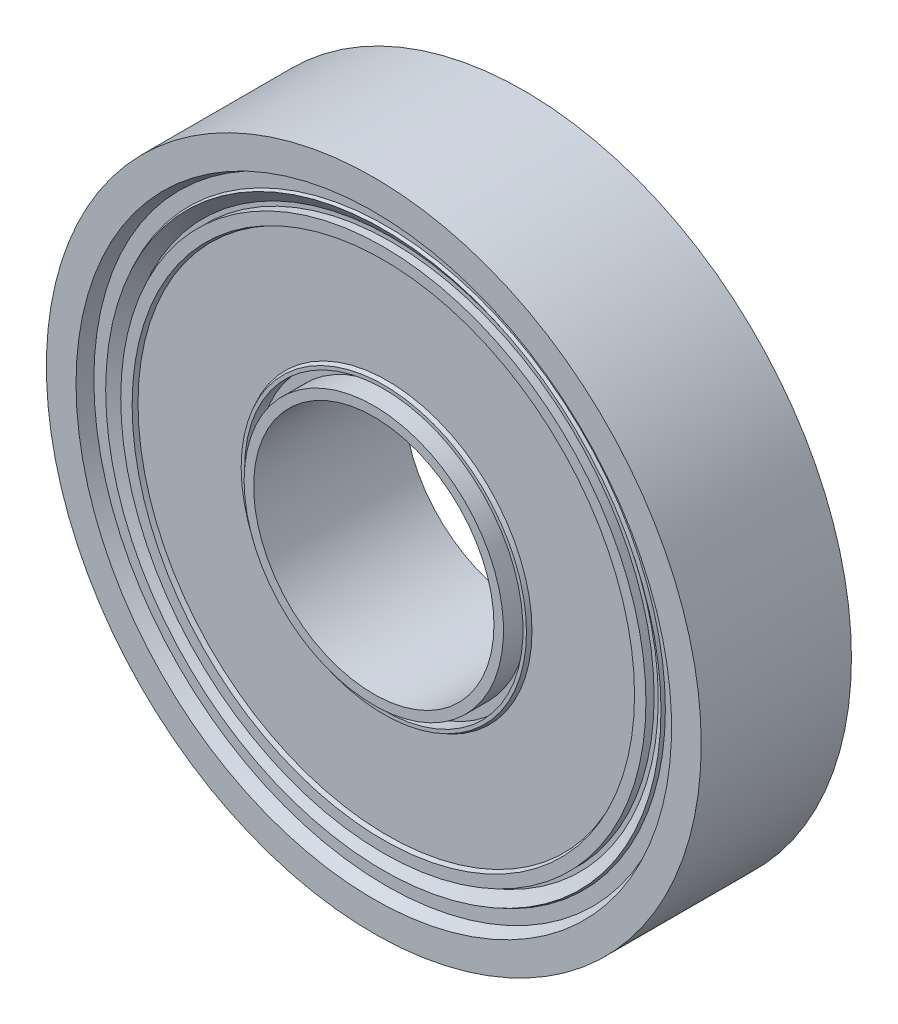
ISO-10303-21;
HEADER;
FILE_DESCRIPTION(('STEP AP214'),'2;1');
FILE_NAME('part.step','',(''),(''),'','','');
FILE_SCHEMA(('AUTOMOTIVE_DESIGN { 1 0 10303 214 1 1 1 1 }'));
ENDSEC;
DATA;
#1=APPLICATION_CONTEXT('core data for automotive mechanical design processes');
#2=APPLICATION_PROTOCOL_DEFINITION('international standard','automotive_design',2000,#1);
#3=PRODUCT_CONTEXT('',#1,'mechanical');
#4=PRODUCT('Part','Part','',(#3));
#5=PRODUCT_RELATED_PRODUCT_CATEGORY('part','',(#4));
#6=PRODUCT_DEFINITION_FORMATION('','',#4);
#7=PRODUCT_DEFINITION_CONTEXT('part definition',#1,'design');
#8=PRODUCT_DEFINITION('design','',#6,#7);
#9=PRODUCT_DEFINITION_SHAPE('','',#8);
#10=(LENGTH_UNIT() NAMED_UNIT(*) SI_UNIT(.MILLI.,.METRE.));
#11=(NAMED_UNIT(*) PLANE_ANGLE_UNIT() SI_UNIT($,.RADIAN.));
#12=(NAMED_UNIT(*) SI_UNIT($,.STERADIAN.) SOLID_ANGLE_UNIT());
#13=UNCERTAINTY_MEASURE_WITH_UNIT(LENGTH_MEASURE(1.E-05),#10,'distance_accuracy_value','');
#14=(GEOMETRIC_REPRESENTATION_CONTEXT(3) GLOBAL_UNCERTAINTY_ASSIGNED_CONTEXT((#13)) GLOBAL_UNIT_ASSIGNED_CONTEXT((#10,
#11,#12)) REPRESENTATION_CONTEXT('',''));
#15=CARTESIAN_POINT('',(0.,0.,0.));
#16=DIRECTION('',(0.,0.,1.));
#17=DIRECTION('',(1.,0.,0.));
#18=AXIS2_PLACEMENT_3D('',#15,#16,#17);
#19=CARTESIAN_POINT('',(0.,0.,0.));
#20=DIRECTION('',(0.,0.,1.));
#21=DIRECTION('',(1.,0.,0.));
#22=AXIS2_PLACEMENT_3D('',#19,#20,#21);
#23=PLANE('',#22);
#24=CARTESIAN_POINT('',(0.,0.,0.));
#25=DIRECTION('',(0.,0.,1.));
#26=DIRECTION('',(1.,0.,0.));
#27=AXIS2_PLACEMENT_3D('',#24,#25,#26);
#28=CIRCLE('',#27,10.9);
#29=CARTESIAN_POINT('',(10.9,0.,0.));
#30=VERTEX_POINT('',#29);
#31=EDGE_CURVE('E42',#30,#30,#28,.T.);
#32=ORIENTED_EDGE('',*,*,#31,.F.);
#33=EDGE_LOOP('',(#32));
#34=FACE_BOUND('',#33,.T.);
#35=CARTESIAN_POINT('',(0.,0.,0.));
#36=DIRECTION('',(0.,0.,-1.));
#37=DIRECTION('',(-1.,0.,0.));
#38=AXIS2_PLACEMENT_3D('',#35,#36,#37);
#39=CIRCLE('',#38,9.91293924454827);
#40=CARTESIAN_POINT('',(-9.91293924454827,0.,0.));
#41=VERTEX_POINT('',#40);
#42=EDGE_CURVE('E57',#41,#41,#39,.T.);
#43=ORIENTED_EDGE('',*,*,#42,.F.);
#44=EDGE_LOOP('',(#43));
#45=FACE_BOUND('',#44,.T.);
#46=ADVANCED_FACE('F38',(#34,#45),#23,.F.);
#47=CARTESIAN_POINT('',(0.,0.,5.));
#48=DIRECTION('',(0.,0.,1.));
#49=DIRECTION('',(1.,0.,0.));
#50=AXIS2_PLACEMENT_3D('',#47,#48,#49);
#51=PLANE('',#50);
#52=CARTESIAN_POINT('',(0.,0.,5.));
#53=DIRECTION('',(0.,0.,-1.));
#54=DIRECTION('',(-1.,0.,0.));
#55=AXIS2_PLACEMENT_3D('',#52,#53,#54);
#56=CIRCLE('',#55,9.91293924454827);
#57=CARTESIAN_POINT('',(-9.91293924454827,0.,5.));
#58=VERTEX_POINT('',#57);
#59=EDGE_CURVE('E60',#58,#58,#56,.T.);
#60=ORIENTED_EDGE('',*,*,#59,.T.);
#61=EDGE_LOOP('',(#60));
#62=FACE_BOUND('',#61,.T.);
#63=CARTESIAN_POINT('',(0.,0.,5.));
#64=DIRECTION('',(0.,0.,1.));
#65=DIRECTION('',(1.,0.,0.));
#66=AXIS2_PLACEMENT_3D('',#63,#64,#65);
#67=CIRCLE('',#66,10.9);
#68=CARTESIAN_POINT('',(10.9,0.,5.));
#69=VERTEX_POINT('',#68);
#70=EDGE_CURVE('E10',#69,#69,#67,.T.);
#71=ORIENTED_EDGE('',*,*,#70,.T.);
#72=EDGE_LOOP('',(#71));
#73=FACE_BOUND('',#72,.T.);
#74=ADVANCED_FACE('F147',(#62,#73),#51,.T.);
#75=CARTESIAN_POINT('',(0.,0.,5.));
#76=DIRECTION('',(0.,0.,-1.));
#77=DIRECTION('',(-1.,0.,0.));
#78=AXIS2_PLACEMENT_3D('',#75,#76,#77);
#79=CYLINDRICAL_SURFACE('',#78,10.9);
#80=ORIENTED_EDGE('',*,*,#70,.F.);
#81=EDGE_LOOP('',(#80));
#82=FACE_BOUND('',#81,.T.);
#83=ORIENTED_EDGE('',*,*,#31,.T.);
#84=EDGE_LOOP('',(#83));
#85=FACE_BOUND('',#84,.T.);
#86=ADVANCED_FACE('F40',(#82,#85),#79,.T.);
#87=CARTESIAN_POINT('',(0.,0.,0.));
#88=DIRECTION('',(0.,0.,-1.));
#89=DIRECTION('',(-1.,0.,0.));
#90=AXIS2_PLACEMENT_3D('',#87,#88,#89);
#91=CONICAL_SURFACE('',#90,9.91293924454827,0.410906341735328);
#92=CARTESIAN_POINT('',(0.,0.,0.413057315334044));
#93=DIRECTION('',(0.,0.,-1.));
#94=DIRECTION('',(-1.,0.,0.));
#95=AXIS2_PLACEMENT_3D('',#92,#93,#94);
#96=CIRCLE('',#95,9.73296637910687);
#97=CARTESIAN_POINT('',(-9.73296637910687,0.,0.413057315334044));
#98=VERTEX_POINT('',#97);
#99=EDGE_CURVE('E61',#98,#98,#96,.T.);
#100=ORIENTED_EDGE('',*,*,#99,.F.);
#101=EDGE_LOOP('',(#100));
#102=FACE_BOUND('',#101,.T.);
#103=ORIENTED_EDGE('',*,*,#42,.T.);
#104=EDGE_LOOP('',(#103));
#105=FACE_BOUND('',#104,.T.);
#106=ADVANCED_FACE('F325',(#102,#105),#91,.F.);
#107=CARTESIAN_POINT('',(-9.73296637910687,0.,0.413057315334044));
#108=DIRECTION('',(0.,0.,1.));
#109=DIRECTION('',(1.,0.,0.));
#110=AXIS2_PLACEMENT_3D('',#107,#108,#109);
#111=PLANE('',#110);
#112=CARTESIAN_POINT('',(0.,0.,0.413057315334044));
#113=DIRECTION('',(0.,0.,-1.));
#114=DIRECTION('',(-1.,0.,0.));
#115=AXIS2_PLACEMENT_3D('',#112,#113,#114);
#116=CIRCLE('',#115,9.29331335232563);
#117=CARTESIAN_POINT('',(-9.29331335232563,0.,0.413057315334044));
#118=VERTEX_POINT('',#117);
#119=EDGE_CURVE('E64',#118,#118,#116,.T.);
#120=ORIENTED_EDGE('',*,*,#119,.F.);
#121=EDGE_LOOP('',(#120));
#122=FACE_BOUND('',#121,.T.);
#123=ORIENTED_EDGE('',*,*,#99,.T.);
#124=EDGE_LOOP('',(#123));
#125=FACE_BOUND('',#124,.T.);
#126=ADVANCED_FACE('F319',(#122,#125),#111,.F.);
#127=CARTESIAN_POINT('',(0.,0.,0.413057315334044));
#128=DIRECTION('',(0.,0.,1.));
#129=DIRECTION('',(1.,0.,0.));
#130=AXIS2_PLACEMENT_3D('',#127,#128,#129);
#131=CONICAL_SURFACE('',#130,9.29331335232563,0.4817608629615);
#132=CARTESIAN_POINT('',(0.,0.,0.31713796498969));
#133=DIRECTION('',(0.,0.,-1.));
#134=DIRECTION('',(-1.,0.,0.));
#135=AXIS2_PLACEMENT_3D('',#132,#133,#134);
#136=CIRCLE('',#135,9.24316182218617);
#137=CARTESIAN_POINT('',(-9.24316182218617,0.,0.31713796498969));
#138=VERTEX_POINT('',#137);
#139=EDGE_CURVE('E67',#138,#138,#136,.T.);
#140=ORIENTED_EDGE('',*,*,#139,.F.);
#141=EDGE_LOOP('',(#140));
#142=FACE_BOUND('',#141,.T.);
#143=ORIENTED_EDGE('',*,*,#119,.T.);
#144=EDGE_LOOP('',(#143));
#145=FACE_BOUND('',#144,.T.);
#146=ADVANCED_FACE('F313',(#142,#145),#131,.T.);
#147=CARTESIAN_POINT('',(0.,0.,0.31713796498969));
#148=DIRECTION('',(0.,0.,-1.));
#149=DIRECTION('',(-1.,0.,0.));
#150=AXIS2_PLACEMENT_3D('',#147,#148,#149);
#151=CONICAL_SURFACE('',#150,9.24316182218617,0.927295218001614);
#152=CARTESIAN_POINT('',(0.,0.,0.590447756283406));
#153=DIRECTION('',(0.,0.,-1.));
#154=DIRECTION('',(-1.,0.,0.));
#155=AXIS2_PLACEMENT_3D('',#152,#153,#154);
#156=CIRCLE('',#155,8.87874876712788);
#157=CARTESIAN_POINT('',(-8.87874876712788,0.,0.590447756283406));
#158=VERTEX_POINT('',#157);
#159=EDGE_CURVE('E70',#158,#158,#156,.T.);
#160=ORIENTED_EDGE('',*,*,#159,.F.);
#161=EDGE_LOOP('',(#160));
#162=FACE_BOUND('',#161,.T.);
#163=ORIENTED_EDGE('',*,*,#139,.T.);
#164=EDGE_LOOP('',(#163));
#165=FACE_BOUND('',#164,.T.);
#166=ADVANCED_FACE('F307',(#162,#165),#151,.F.);
#167=CARTESIAN_POINT('',(-8.87874876712788,0.,0.590447756283406));
#168=DIRECTION('',(0.,0.,1.));
#169=DIRECTION('',(1.,0.,0.));
#170=AXIS2_PLACEMENT_3D('',#167,#168,#169);
#171=PLANE('',#170);
#172=CARTESIAN_POINT('',(0.,0.,0.590447756283406));
#173=DIRECTION('',(0.,0.,-1.));
#174=DIRECTION('',(-1.,0.,0.));
#175=AXIS2_PLACEMENT_3D('',#172,#173,#174);
#176=CIRCLE('',#175,8.74209387148102);
#177=CARTESIAN_POINT('',(-8.74209387148102,0.,0.590447756283406));
#178=VERTEX_POINT('',#177);
#179=EDGE_CURVE('E73',#178,#178,#176,.T.);
#180=ORIENTED_EDGE('',*,*,#179,.F.);
#181=EDGE_LOOP('',(#180));
#182=FACE_BOUND('',#181,.T.);
#183=ORIENTED_EDGE('',*,*,#159,.T.);
#184=EDGE_LOOP('',(#183));
#185=FACE_BOUND('',#184,.T.);
#186=ADVANCED_FACE('F301',(#182,#185),#171,.F.);
#187=CARTESIAN_POINT('',(0.,0.,0.));
#188=DIRECTION('',(0.,0.,-1.));
#189=DIRECTION('',(-1.,0.,0.));
#190=AXIS2_PLACEMENT_3D('',#187,#188,#189);
#191=CYLINDRICAL_SURFACE('',#190,8.74209387148102);
#192=CARTESIAN_POINT('',(0.,0.,0.31713796498969));
#193=DIRECTION('',(0.,0.,-1.));
#194=DIRECTION('',(-1.,0.,0.));
#195=AXIS2_PLACEMENT_3D('',#192,#193,#194);
#196=CIRCLE('',#195,8.74209387148102);
#197=CARTESIAN_POINT('',(-8.74209387148102,0.,0.31713796498969));
#198=VERTEX_POINT('',#197);
#199=EDGE_CURVE('E76',#198,#198,#196,.T.);
#200=ORIENTED_EDGE('',*,*,#199,.F.);
#201=EDGE_LOOP('',(#200));
#202=FACE_BOUND('',#201,.T.);
#203=ORIENTED_EDGE('',*,*,#179,.T.);
#204=EDGE_LOOP('',(#203));
#205=FACE_BOUND('',#204,.T.);
#206=ADVANCED_FACE('F295',(#202,#205),#191,.T.);
#207=CARTESIAN_POINT('',(-8.74209387148102,0.,0.31713796498969));
#208=DIRECTION('',(0.,0.,1.));
#209=DIRECTION('',(1.,0.,0.));
#210=AXIS2_PLACEMENT_3D('',#207,#208,#209);
#211=PLANE('',#210);
#212=CARTESIAN_POINT('',(0.,0.,0.31713796498969));
#213=DIRECTION('',(0.,0.,-1.));
#214=DIRECTION('',(-1.,0.,0.));
#215=AXIS2_PLACEMENT_3D('',#212,#213,#214);
#216=CIRCLE('',#215,8.36249693912864);
#217=CARTESIAN_POINT('',(-8.36249693912864,0.,0.31713796498969));
#218=VERTEX_POINT('',#217);
#219=EDGE_CURVE('E79',#218,#218,#216,.T.);
#220=ORIENTED_EDGE('',*,*,#219,.F.);
#221=EDGE_LOOP('',(#220));
#222=FACE_BOUND('',#221,.T.);
#223=ORIENTED_EDGE('',*,*,#199,.T.);
#224=EDGE_LOOP('',(#223));
#225=FACE_BOUND('',#224,.T.);
#226=ADVANCED_FACE('F289',(#222,#225),#211,.F.);
#227=CARTESIAN_POINT('',(0.,0.,0.31713796498969));
#228=DIRECTION('',(0.,0.,-1.));
#229=DIRECTION('',(-1.,0.,0.));
#230=AXIS2_PLACEMENT_3D('',#227,#228,#229);
#231=CONICAL_SURFACE('',#230,8.36249693912864,0.410906341735327);
#232=CARTESIAN_POINT('',(0.,0.,0.453792860636549));
#233=DIRECTION('',(0.,0.,-1.));
#234=DIRECTION('',(-1.,0.,0.));
#235=AXIS2_PLACEMENT_3D('',#232,#233,#234);
#236=CIRCLE('',#235,8.3029551461785);
#237=CARTESIAN_POINT('',(-8.3029551461785,0.,0.453792860636549));
#238=VERTEX_POINT('',#237);
#239=EDGE_CURVE('E82',#238,#238,#236,.T.);
#240=ORIENTED_EDGE('',*,*,#239,.F.);
#241=EDGE_LOOP('',(#240));
#242=FACE_BOUND('',#241,.T.);
#243=ORIENTED_EDGE('',*,*,#219,.T.);
#244=EDGE_LOOP('',(#243));
#245=FACE_BOUND('',#244,.T.);
#246=ADVANCED_FACE('F283',(#242,#245),#231,.F.);
#247=CARTESIAN_POINT('',(-8.3029551461785,0.,0.453792860636549));
#248=DIRECTION('',(0.,0.,1.));
#249=DIRECTION('',(1.,0.,0.));
#250=AXIS2_PLACEMENT_3D('',#247,#248,#249);
#251=PLANE('',#250);
#252=CARTESIAN_POINT('',(0.,0.,0.453792860636549));
#253=DIRECTION('',(0.,0.,-1.));
#254=DIRECTION('',(-1.,0.,0.));
#255=AXIS2_PLACEMENT_3D('',#252,#253,#254);
#256=CIRCLE('',#255,4.81224538894744);
#257=CARTESIAN_POINT('',(-4.81224538894744,0.,0.453792860636549));
#258=VERTEX_POINT('',#257);
#259=EDGE_CURVE('E85',#258,#258,#256,.T.);
#260=ORIENTED_EDGE('',*,*,#259,.F.);
#261=EDGE_LOOP('',(#260));
#262=FACE_BOUND('',#261,.T.);
#263=ORIENTED_EDGE('',*,*,#239,.T.);
#264=EDGE_LOOP('',(#263));
#265=FACE_BOUND('',#264,.T.);
#266=ADVANCED_FACE('F277',(#262,#265),#251,.F.);
#267=CARTESIAN_POINT('',(0.,0.,0.453792860636549));
#268=DIRECTION('',(0.,0.,1.));
#269=DIRECTION('',(1.,0.,0.));
#270=AXIS2_PLACEMENT_3D('',#267,#268,#269);
#271=CONICAL_SURFACE('',#270,4.81224538894744,0.481760862961502);
#272=CARTESIAN_POINT('',(0.,0.,0.332321842283785));
#273=DIRECTION('',(0.,0.,-1.));
#274=DIRECTION('',(-1.,0.,0.));
#275=AXIS2_PLACEMENT_3D('',#272,#273,#274);
#276=CIRCLE('',#275,4.74873414313396);
#277=CARTESIAN_POINT('',(-4.74873414313396,0.,0.332321842283785));
#278=VERTEX_POINT('',#277);
#279=EDGE_CURVE('E88',#278,#278,#276,.T.);
#280=ORIENTED_EDGE('',*,*,#279,.F.);
#281=EDGE_LOOP('',(#280));
#282=FACE_BOUND('',#281,.T.);
#283=ORIENTED_EDGE('',*,*,#259,.T.);
#284=EDGE_LOOP('',(#283));
#285=FACE_BOUND('',#284,.T.);
#286=ADVANCED_FACE('F271',(#282,#285),#271,.T.);
#287=CARTESIAN_POINT('',(-4.74873414313396,0.,0.332321842283785));
#288=DIRECTION('',(0.,0.,1.));
#289=DIRECTION('',(1.,0.,0.));
#290=AXIS2_PLACEMENT_3D('',#287,#288,#289);
#291=PLANE('',#290);
#292=CARTESIAN_POINT('',(0.,0.,0.332321842283785));
#293=DIRECTION('',(0.,0.,-1.));
#294=DIRECTION('',(-1.,0.,0.));
#295=AXIS2_PLACEMENT_3D('',#292,#293,#294);
#296=CIRCLE('',#295,4.63566936916117);
#297=CARTESIAN_POINT('',(-4.63566936916117,0.,0.332321842283785));
#298=VERTEX_POINT('',#297);
#299=EDGE_CURVE('E91',#298,#298,#296,.T.);
#300=ORIENTED_EDGE('',*,*,#299,.F.);
#301=EDGE_LOOP('',(#300));
#302=FACE_BOUND('',#301,.T.);
#303=ORIENTED_EDGE('',*,*,#279,.T.);
#304=EDGE_LOOP('',(#303));
#305=FACE_BOUND('',#304,.T.);
#306=ADVANCED_FACE('F265',(#302,#305),#291,.F.);
#307=CARTESIAN_POINT('',(0.,0.,0.));
#308=DIRECTION('',(0.,0.,-1.));
#309=DIRECTION('',(-1.,0.,0.));
#310=AXIS2_PLACEMENT_3D('',#307,#308,#309);
#311=CYLINDRICAL_SURFACE('',#310,4.63566936916117);
#312=CARTESIAN_POINT('',(0.,0.,0.783278670014547));
#313=DIRECTION('',(0.,0.,-1.));
#314=DIRECTION('',(-1.,0.,0.));
#315=AXIS2_PLACEMENT_3D('',#312,#313,#314);
#316=CIRCLE('',#315,4.63566936916117);
#317=CARTESIAN_POINT('',(-4.63566936916117,0.,0.783278670014547));
#318=VERTEX_POINT('',#317);
#319=EDGE_CURVE('E94',#318,#318,#316,.T.);
#320=ORIENTED_EDGE('',*,*,#319,.F.);
#321=EDGE_LOOP('',(#320));
#322=FACE_BOUND('',#321,.T.);
#323=ORIENTED_EDGE('',*,*,#299,.T.);
#324=EDGE_LOOP('',(#323));
#325=FACE_BOUND('',#324,.T.);
#326=ADVANCED_FACE('F259',(#322,#325),#311,.F.);
#327=CARTESIAN_POINT('',(-4.63566936916117,0.,0.783278670014547));
#328=DIRECTION('',(0.,0.,1.));
#329=DIRECTION('',(1.,0.,0.));
#330=AXIS2_PLACEMENT_3D('',#327,#328,#329);
#331=PLANE('',#330);
#332=CARTESIAN_POINT('',(0.,0.,0.783278670014547));
#333=DIRECTION('',(0.,0.,-1.));
#334=DIRECTION('',(-1.,0.,0.));
#335=AXIS2_PLACEMENT_3D('',#332,#333,#334);
#336=CIRCLE('',#335,4.31783468458058);
#337=CARTESIAN_POINT('',(-4.31783468458058,0.,0.783278670014547));
#338=VERTEX_POINT('',#337);
#339=EDGE_CURVE('E97',#338,#338,#336,.T.);
#340=ORIENTED_EDGE('',*,*,#339,.F.);
#341=EDGE_LOOP('',(#340));
#342=FACE_BOUND('',#341,.T.);
#343=ORIENTED_EDGE('',*,*,#319,.T.);
#344=EDGE_LOOP('',(#343));
#345=FACE_BOUND('',#344,.T.);
#346=ADVANCED_FACE('F253',(#342,#345),#331,.F.);
#347=CARTESIAN_POINT('',(0.,0.,0.));
#348=DIRECTION('',(0.,0.,-1.));
#349=DIRECTION('',(-1.,0.,0.));
#350=AXIS2_PLACEMENT_3D('',#347,#348,#349);
#351=CYLINDRICAL_SURFACE('',#350,4.31783468458058);
#352=CARTESIAN_POINT('',(0.,0.,0.));
#353=DIRECTION('',(0.,0.,-1.));
#354=DIRECTION('',(-1.,0.,0.));
#355=AXIS2_PLACEMENT_3D('',#352,#353,#354);
#356=CIRCLE('',#355,4.31783468458058);
#357=CARTESIAN_POINT('',(-4.31783468458058,0.,0.));
#358=VERTEX_POINT('',#357);
#359=EDGE_CURVE('E100',#358,#358,#356,.T.);
#360=ORIENTED_EDGE('',*,*,#359,.F.);
#361=EDGE_LOOP('',(#360));
#362=FACE_BOUND('',#361,.T.);
#363=ORIENTED_EDGE('',*,*,#339,.T.);
#364=EDGE_LOOP('',(#363));
#365=FACE_BOUND('',#364,.T.);
#366=ADVANCED_FACE('F231',(#362,#365),#351,.T.);
#367=CARTESIAN_POINT('',(0.,0.,0.));
#368=DIRECTION('',(0.,0.,-1.));
#369=DIRECTION('',(-1.,0.,0.));
#370=AXIS2_PLACEMENT_3D('',#367,#368,#369);
#371=CYLINDRICAL_SURFACE('',#370,4.31783468458058);
#372=CARTESIAN_POINT('',(0.,0.,4.21672132998545));
#373=DIRECTION('',(0.,0.,-1.));
#374=DIRECTION('',(-1.,0.,0.));
#375=AXIS2_PLACEMENT_3D('',#372,#373,#374);
#376=CIRCLE('',#375,4.31783468458058);
#377=CARTESIAN_POINT('',(-4.31783468458058,0.,4.21672132998545));
#378=VERTEX_POINT('',#377);
#379=EDGE_CURVE('E105',#378,#378,#376,.T.);
#380=ORIENTED_EDGE('',*,*,#379,.F.);
#381=EDGE_LOOP('',(#380));
#382=FACE_BOUND('',#381,.T.);
#383=CARTESIAN_POINT('',(0.,0.,5.));
#384=DIRECTION('',(0.,0.,-1.));
#385=DIRECTION('',(-1.,0.,0.));
#386=AXIS2_PLACEMENT_3D('',#383,#384,#385);
#387=CIRCLE('',#386,4.31783468458058);
#388=CARTESIAN_POINT('',(-4.31783468458058,0.,5.));
#389=VERTEX_POINT('',#388);
#390=EDGE_CURVE('E54',#389,#389,#387,.T.);
#391=ORIENTED_EDGE('',*,*,#390,.T.);
#392=EDGE_LOOP('',(#391));
#393=FACE_BOUND('',#392,.T.);
#394=ADVANCED_FACE('F225',(#382,#393),#371,.T.);
#395=CARTESIAN_POINT('',(-4.63566936916117,0.,4.21672132998545));
#396=DIRECTION('',(0.,0.,-1.));
#397=DIRECTION('',(-1.,0.,0.));
#398=AXIS2_PLACEMENT_3D('',#395,#396,#397);
#399=PLANE('',#398);
#400=CARTESIAN_POINT('',(0.,0.,4.21672132998545));
#401=DIRECTION('',(0.,0.,-1.));
#402=DIRECTION('',(-1.,0.,0.));
#403=AXIS2_PLACEMENT_3D('',#400,#401,#402);
#404=CIRCLE('',#403,4.63566936916117);
#405=CARTESIAN_POINT('',(-4.63566936916117,0.,4.21672132998545));
#406=VERTEX_POINT('',#405);
#407=EDGE_CURVE('E108',#406,#406,#404,.T.);
#408=ORIENTED_EDGE('',*,*,#407,.F.);
#409=EDGE_LOOP('',(#408));
#410=FACE_BOUND('',#409,.T.);
#411=ORIENTED_EDGE('',*,*,#379,.T.);
#412=EDGE_LOOP('',(#411));
#413=FACE_BOUND('',#412,.T.);
#414=ADVANCED_FACE('F219',(#410,#413),#399,.F.);
#415=CARTESIAN_POINT('',(0.,0.,0.));
#416=DIRECTION('',(0.,0.,-1.));
#417=DIRECTION('',(-1.,0.,0.));
#418=AXIS2_PLACEMENT_3D('',#415,#416,#417);
#419=CYLINDRICAL_SURFACE('',#418,4.63566936916117);
#420=CARTESIAN_POINT('',(0.,0.,4.66767815771621));
#421=DIRECTION('',(0.,0.,-1.));
#422=DIRECTION('',(-1.,0.,0.));
#423=AXIS2_PLACEMENT_3D('',#420,#421,#422);
#424=CIRCLE('',#423,4.63566936916117);
#425=CARTESIAN_POINT('',(-4.63566936916117,0.,4.66767815771621));
#426=VERTEX_POINT('',#425);
#427=EDGE_CURVE('E111',#426,#426,#424,.T.);
#428=ORIENTED_EDGE('',*,*,#427,.F.);
#429=EDGE_LOOP('',(#428));
#430=FACE_BOUND('',#429,.T.);
#431=ORIENTED_EDGE('',*,*,#407,.T.);
#432=EDGE_LOOP('',(#431));
#433=FACE_BOUND('',#432,.T.);
#434=ADVANCED_FACE('F213',(#430,#433),#419,.F.);
#435=CARTESIAN_POINT('',(-4.74873414313396,0.,4.66767815771621));
#436=DIRECTION('',(0.,0.,-1.));
#437=DIRECTION('',(-1.,0.,0.));
#438=AXIS2_PLACEMENT_3D('',#435,#436,#437);
#439=PLANE('',#438);
#440=CARTESIAN_POINT('',(0.,0.,4.66767815771621));
#441=DIRECTION('',(0.,0.,-1.));
#442=DIRECTION('',(-1.,0.,0.));
#443=AXIS2_PLACEMENT_3D('',#440,#441,#442);
#444=CIRCLE('',#443,4.74873414313396);
#445=CARTESIAN_POINT('',(-4.74873414313396,0.,4.66767815771621));
#446=VERTEX_POINT('',#445);
#447=EDGE_CURVE('E114',#446,#446,#444,.T.);
#448=ORIENTED_EDGE('',*,*,#447,.F.);
#449=EDGE_LOOP('',(#448));
#450=FACE_BOUND('',#449,.T.);
#451=ORIENTED_EDGE('',*,*,#427,.T.);
#452=EDGE_LOOP('',(#451));
#453=FACE_BOUND('',#452,.T.);
#454=ADVANCED_FACE('F207',(#450,#453),#439,.F.);
#455=CARTESIAN_POINT('',(0.,0.,4.66767815771621));
#456=DIRECTION('',(0.,0.,-1.));
#457=DIRECTION('',(-1.,0.,0.));
#458=AXIS2_PLACEMENT_3D('',#455,#456,#457);
#459=CONICAL_SURFACE('',#458,4.74873414313396,0.481760862961502);
#460=CARTESIAN_POINT('',(0.,0.,4.54620713936345));
#461=DIRECTION('',(0.,0.,-1.));
#462=DIRECTION('',(-1.,0.,0.));
#463=AXIS2_PLACEMENT_3D('',#460,#461,#462);
#464=CIRCLE('',#463,4.81224538894744);
#465=CARTESIAN_POINT('',(-4.81224538894744,0.,4.54620713936345));
#466=VERTEX_POINT('',#465);
#467=EDGE_CURVE('E117',#466,#466,#464,.T.);
#468=ORIENTED_EDGE('',*,*,#467,.F.);
#469=EDGE_LOOP('',(#468));
#470=FACE_BOUND('',#469,.T.);
#471=ORIENTED_EDGE('',*,*,#447,.T.);
#472=EDGE_LOOP('',(#471));
#473=FACE_BOUND('',#472,.T.);
#474=ADVANCED_FACE('F201',(#470,#473),#459,.T.);
#475=CARTESIAN_POINT('',(-8.3029551461785,0.,4.54620713936345));
#476=DIRECTION('',(0.,0.,-1.));
#477=DIRECTION('',(-1.,0.,0.));
#478=AXIS2_PLACEMENT_3D('',#475,#476,#477);
#479=PLANE('',#478);
#480=CARTESIAN_POINT('',(0.,0.,4.54620713936345));
#481=DIRECTION('',(0.,0.,-1.));
#482=DIRECTION('',(-1.,0.,0.));
#483=AXIS2_PLACEMENT_3D('',#480,#481,#482);
#484=CIRCLE('',#483,8.3029551461785);
#485=CARTESIAN_POINT('',(-8.3029551461785,0.,4.54620713936345));
#486=VERTEX_POINT('',#485);
#487=EDGE_CURVE('E120',#486,#486,#484,.T.);
#488=ORIENTED_EDGE('',*,*,#487,.F.);
#489=EDGE_LOOP('',(#488));
#490=FACE_BOUND('',#489,.T.);
#491=ORIENTED_EDGE('',*,*,#467,.T.);
#492=EDGE_LOOP('',(#491));
#493=FACE_BOUND('',#492,.T.);
#494=ADVANCED_FACE('F195',(#490,#493),#479,.F.);
#495=CARTESIAN_POINT('',(0.,0.,4.54620713936345));
#496=DIRECTION('',(0.,0.,1.));
#497=DIRECTION('',(1.,0.,0.));
#498=AXIS2_PLACEMENT_3D('',#495,#496,#497);
#499=CONICAL_SURFACE('',#498,8.3029551461785,0.410906341735327);
#500=CARTESIAN_POINT('',(0.,0.,4.68286203501031));
#501=DIRECTION('',(0.,0.,-1.));
#502=DIRECTION('',(-1.,0.,0.));
#503=AXIS2_PLACEMENT_3D('',#500,#501,#502);
#504=CIRCLE('',#503,8.36249693912864);
#505=CARTESIAN_POINT('',(-8.36249693912864,0.,4.68286203501031));
#506=VERTEX_POINT('',#505);
#507=EDGE_CURVE('E123',#506,#506,#504,.T.);
#508=ORIENTED_EDGE('',*,*,#507,.F.);
#509=EDGE_LOOP('',(#508));
#510=FACE_BOUND('',#509,.T.);
#511=ORIENTED_EDGE('',*,*,#487,.T.);
#512=EDGE_LOOP('',(#511));
#513=FACE_BOUND('',#512,.T.);
#514=ADVANCED_FACE('F189',(#510,#513),#499,.F.);
#515=CARTESIAN_POINT('',(-8.74209387148102,0.,4.68286203501031));
#516=DIRECTION('',(0.,0.,-1.));
#517=DIRECTION('',(-1.,0.,0.));
#518=AXIS2_PLACEMENT_3D('',#515,#516,#517);
#519=PLANE('',#518);
#520=CARTESIAN_POINT('',(0.,0.,4.68286203501031));
#521=DIRECTION('',(0.,0.,-1.));
#522=DIRECTION('',(-1.,0.,0.));
#523=AXIS2_PLACEMENT_3D('',#520,#521,#522);
#524=CIRCLE('',#523,8.74209387148102);
#525=CARTESIAN_POINT('',(-8.74209387148102,0.,4.68286203501031));
#526=VERTEX_POINT('',#525);
#527=EDGE_CURVE('E126',#526,#526,#524,.T.);
#528=ORIENTED_EDGE('',*,*,#527,.F.);
#529=EDGE_LOOP('',(#528));
#530=FACE_BOUND('',#529,.T.);
#531=ORIENTED_EDGE('',*,*,#507,.T.);
#532=EDGE_LOOP('',(#531));
#533=FACE_BOUND('',#532,.T.);
#534=ADVANCED_FACE('F183',(#530,#533),#519,.F.);
#535=CARTESIAN_POINT('',(0.,0.,0.));
#536=DIRECTION('',(0.,0.,-1.));
#537=DIRECTION('',(-1.,0.,0.));
#538=AXIS2_PLACEMENT_3D('',#535,#536,#537);
#539=CYLINDRICAL_SURFACE('',#538,8.74209387148102);
#540=CARTESIAN_POINT('',(0.,0.,4.40955224371659));
#541=DIRECTION('',(0.,0.,-1.));
#542=DIRECTION('',(-1.,0.,0.));
#543=AXIS2_PLACEMENT_3D('',#540,#541,#542);
#544=CIRCLE('',#543,8.74209387148102);
#545=CARTESIAN_POINT('',(-8.74209387148102,0.,4.40955224371659));
#546=VERTEX_POINT('',#545);
#547=EDGE_CURVE('E129',#546,#546,#544,.T.);
#548=ORIENTED_EDGE('',*,*,#547,.F.);
#549=EDGE_LOOP('',(#548));
#550=FACE_BOUND('',#549,.T.);
#551=ORIENTED_EDGE('',*,*,#527,.T.);
#552=EDGE_LOOP('',(#551));
#553=FACE_BOUND('',#552,.T.);
#554=ADVANCED_FACE('F177',(#550,#553),#539,.T.);
#555=CARTESIAN_POINT('',(-8.87874876712788,0.,4.40955224371659));
#556=DIRECTION('',(0.,0.,-1.));
#557=DIRECTION('',(-1.,0.,0.));
#558=AXIS2_PLACEMENT_3D('',#555,#556,#557);
#559=PLANE('',#558);
#560=CARTESIAN_POINT('',(0.,0.,4.40955224371659));
#561=DIRECTION('',(0.,0.,-1.));
#562=DIRECTION('',(-1.,0.,0.));
#563=AXIS2_PLACEMENT_3D('',#560,#561,#562);
#564=CIRCLE('',#563,8.87874876712788);
#565=CARTESIAN_POINT('',(-8.87874876712788,0.,4.40955224371659));
#566=VERTEX_POINT('',#565);
#567=EDGE_CURVE('E132',#566,#566,#564,.T.);
#568=ORIENTED_EDGE('',*,*,#567,.F.);
#569=EDGE_LOOP('',(#568));
#570=FACE_BOUND('',#569,.T.);
#571=ORIENTED_EDGE('',*,*,#547,.T.);
#572=EDGE_LOOP('',(#571));
#573=FACE_BOUND('',#572,.T.);
#574=ADVANCED_FACE('F171',(#570,#573),#559,.F.);
#575=CARTESIAN_POINT('',(0.,0.,4.40955224371659));
#576=DIRECTION('',(0.,0.,1.));
#577=DIRECTION('',(1.,0.,0.));
#578=AXIS2_PLACEMENT_3D('',#575,#576,#577);
#579=CONICAL_SURFACE('',#578,8.87874876712788,0.927295218001614);
#580=CARTESIAN_POINT('',(0.,0.,4.68286203501031));
#581=DIRECTION('',(0.,0.,-1.));
#582=DIRECTION('',(-1.,0.,0.));
#583=AXIS2_PLACEMENT_3D('',#580,#581,#582);
#584=CIRCLE('',#583,9.24316182218617);
#585=CARTESIAN_POINT('',(-9.24316182218617,0.,4.68286203501031));
#586=VERTEX_POINT('',#585);
#587=EDGE_CURVE('E135',#586,#586,#584,.T.);
#588=ORIENTED_EDGE('',*,*,#587,.F.);
#589=EDGE_LOOP('',(#588));
#590=FACE_BOUND('',#589,.T.);
#591=ORIENTED_EDGE('',*,*,#567,.T.);
#592=EDGE_LOOP('',(#591));
#593=FACE_BOUND('',#592,.T.);
#594=ADVANCED_FACE('F165',(#590,#593),#579,.F.);
#595=CARTESIAN_POINT('',(0.,0.,4.68286203501031));
#596=DIRECTION('',(0.,0.,-1.));
#597=DIRECTION('',(-1.,0.,0.));
#598=AXIS2_PLACEMENT_3D('',#595,#596,#597);
#599=CONICAL_SURFACE('',#598,9.24316182218617,0.4817608629615);
#600=CARTESIAN_POINT('',(0.,0.,4.58694268466596));
#601=DIRECTION('',(0.,0.,-1.));
#602=DIRECTION('',(-1.,0.,0.));
#603=AXIS2_PLACEMENT_3D('',#600,#601,#602);
#604=CIRCLE('',#603,9.29331335232563);
#605=CARTESIAN_POINT('',(-9.29331335232563,0.,4.58694268466596));
#606=VERTEX_POINT('',#605);
#607=EDGE_CURVE('E138',#606,#606,#604,.T.);
#608=ORIENTED_EDGE('',*,*,#607,.F.);
#609=EDGE_LOOP('',(#608));
#610=FACE_BOUND('',#609,.T.);
#611=ORIENTED_EDGE('',*,*,#587,.T.);
#612=EDGE_LOOP('',(#611));
#613=FACE_BOUND('',#612,.T.);
#614=ADVANCED_FACE('F159',(#610,#613),#599,.T.);
#615=CARTESIAN_POINT('',(-9.73296637910687,0.,4.58694268466596));
#616=DIRECTION('',(0.,0.,-1.));
#617=DIRECTION('',(-1.,0.,0.));
#618=AXIS2_PLACEMENT_3D('',#615,#616,#617);
#619=PLANE('',#618);
#620=CARTESIAN_POINT('',(0.,0.,4.58694268466596));
#621=DIRECTION('',(0.,0.,-1.));
#622=DIRECTION('',(-1.,0.,0.));
#623=AXIS2_PLACEMENT_3D('',#620,#621,#622);
#624=CIRCLE('',#623,9.73296637910687);
#625=CARTESIAN_POINT('',(-9.73296637910687,0.,4.58694268466596));
#626=VERTEX_POINT('',#625);
#627=EDGE_CURVE('E141',#626,#626,#624,.T.);
#628=ORIENTED_EDGE('',*,*,#627,.F.);
#629=EDGE_LOOP('',(#628));
#630=FACE_BOUND('',#629,.T.);
#631=ORIENTED_EDGE('',*,*,#607,.T.);
#632=EDGE_LOOP('',(#631));
#633=FACE_BOUND('',#632,.T.);
#634=ADVANCED_FACE('F153',(#630,#633),#619,.F.);
#635=CARTESIAN_POINT('',(0.,0.,4.58694268466596));
#636=DIRECTION('',(0.,0.,1.));
#637=DIRECTION('',(1.,0.,0.));
#638=AXIS2_PLACEMENT_3D('',#635,#636,#637);
#639=CONICAL_SURFACE('',#638,9.73296637910687,0.410906341735328);
#640=ORIENTED_EDGE('',*,*,#59,.F.);
#641=EDGE_LOOP('',(#640));
#642=FACE_BOUND('',#641,.T.);
#643=ORIENTED_EDGE('',*,*,#627,.T.);
#644=EDGE_LOOP('',(#643));
#645=FACE_BOUND('',#644,.T.);
#646=ADVANCED_FACE('F149',(#642,#645),#639,.F.);
#647=ORIENTED_EDGE('',*,*,#390,.F.);
#648=EDGE_LOOP('',(#647));
#649=FACE_BOUND('',#648,.T.);
#650=CARTESIAN_POINT('',(0.,0.,5.));
#651=DIRECTION('',(0.,0.,1.));
#652=DIRECTION('',(1.,0.,0.));
#653=AXIS2_PLACEMENT_3D('',#650,#651,#652);
#654=CIRCLE('',#653,4.);
#655=CARTESIAN_POINT('',(4.,0.,5.));
#656=VERTEX_POINT('',#655);
#657=EDGE_CURVE('E49',#656,#656,#654,.T.);
#658=ORIENTED_EDGE('',*,*,#657,.F.);
#659=EDGE_LOOP('',(#658));
#660=FACE_BOUND('',#659,.T.);
#661=ADVANCED_FACE('F152',(#649,#660),#51,.T.);
#662=CARTESIAN_POINT('',(0.,0.,5.));
#663=DIRECTION('',(0.,0.,-1.));
#664=DIRECTION('',(-1.,0.,0.));
#665=AXIS2_PLACEMENT_3D('',#662,#663,#664);
#666=CYLINDRICAL_SURFACE('',#665,4.);
#667=ORIENTED_EDGE('',*,*,#657,.T.);
#668=EDGE_LOOP('',(#667));
#669=FACE_BOUND('',#668,.T.);
#670=CARTESIAN_POINT('',(0.,0.,0.));
#671=DIRECTION('',(0.,0.,1.));
#672=DIRECTION('',(1.,0.,0.));
#673=AXIS2_PLACEMENT_3D('',#670,#671,#672);
#674=CIRCLE('',#673,4.);
#675=CARTESIAN_POINT('',(4.,0.,0.));
#676=VERTEX_POINT('',#675);
#677=EDGE_CURVE('E51',#676,#676,#674,.T.);
#678=ORIENTED_EDGE('',*,*,#677,.F.);
#679=EDGE_LOOP('',(#678));
#680=FACE_BOUND('',#679,.T.);
#681=ADVANCED_FACE('F237',(#669,#680),#666,.F.);
#682=ORIENTED_EDGE('',*,*,#677,.T.);
#683=EDGE_LOOP('',(#682));
#684=FACE_BOUND('',#683,.T.);
#685=ORIENTED_EDGE('',*,*,#359,.T.);
#686=EDGE_LOOP('',(#685));
#687=FACE_BOUND('',#686,.T.);
#688=ADVANCED_FACE('F243',(#684,#687),#23,.F.);
#689=CLOSED_SHELL('',(#46,#74,#86,#106,#126,#146,#166,#186,#206,#226,#246,#266,#286,#306,#326,
#346,#366,#394,#414,#434,#454,#474,#494,#514,#534,#554,#574,#594,#614,#634,#646,#661,#681,#688));
#690=MANIFOLD_SOLID_BREP('B2',#689);
#691=ADVANCED_BREP_SHAPE_REPRESENTATION('',(#18,#690),#14);
#692=SHAPE_DEFINITION_REPRESENTATION(#9,#691);
ENDSEC;
END-ISO-10303-21;
